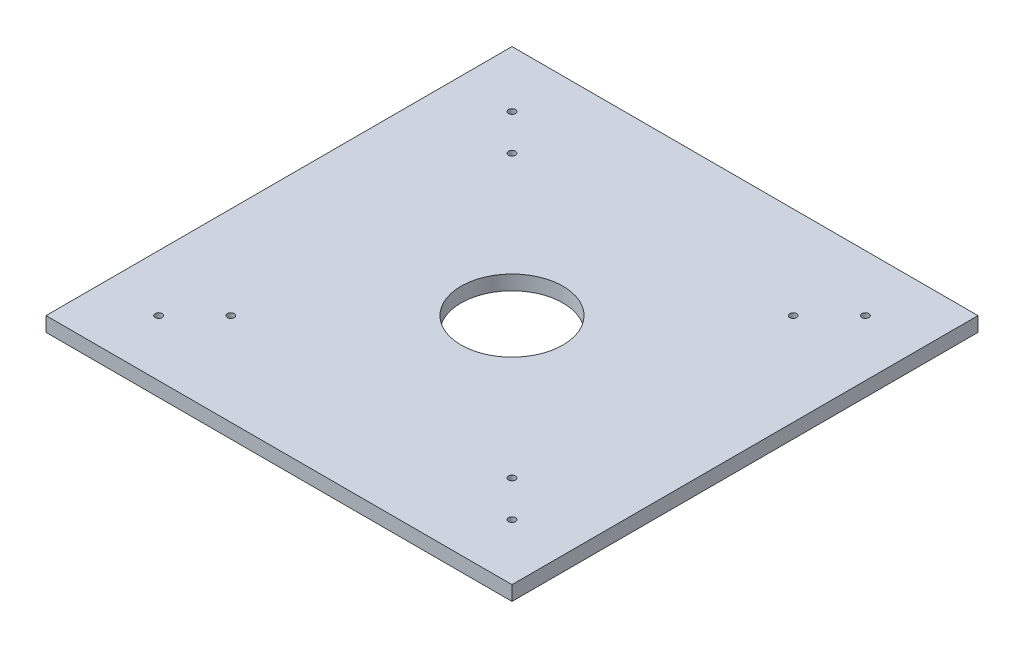
ISO-10303-21;
HEADER;
FILE_DESCRIPTION(('STEP AP214'),'2;1');
FILE_NAME('part.step','',(''),(''),'','','');
FILE_SCHEMA(('AUTOMOTIVE_DESIGN { 1 0 10303 214 1 1 1 1 }'));
ENDSEC;
DATA;
#1=APPLICATION_CONTEXT('core data for automotive mechanical design processes');
#2=APPLICATION_PROTOCOL_DEFINITION('international standard','automotive_design',2000,#1);
#3=PRODUCT_CONTEXT('',#1,'mechanical');
#4=PRODUCT('Part','Part','',(#3));
#5=PRODUCT_RELATED_PRODUCT_CATEGORY('part','',(#4));
#6=PRODUCT_DEFINITION_FORMATION('','',#4);
#7=PRODUCT_DEFINITION_CONTEXT('part definition',#1,'design');
#8=PRODUCT_DEFINITION('design','',#6,#7);
#9=PRODUCT_DEFINITION_SHAPE('','',#8);
#10=(LENGTH_UNIT() NAMED_UNIT(*) SI_UNIT(.MILLI.,.METRE.));
#11=(NAMED_UNIT(*) PLANE_ANGLE_UNIT() SI_UNIT($,.RADIAN.));
#12=(NAMED_UNIT(*) SI_UNIT($,.STERADIAN.) SOLID_ANGLE_UNIT());
#13=UNCERTAINTY_MEASURE_WITH_UNIT(LENGTH_MEASURE(1.E-05),#10,'distance_accuracy_value','');
#14=(GEOMETRIC_REPRESENTATION_CONTEXT(3) GLOBAL_UNCERTAINTY_ASSIGNED_CONTEXT((#13)) GLOBAL_UNIT_ASSIGNED_CONTEXT((#10,
#11,#12)) REPRESENTATION_CONTEXT('',''));
#15=CARTESIAN_POINT('',(0.,0.,0.));
#16=DIRECTION('',(0.,0.,1.));
#17=DIRECTION('',(1.,0.,0.));
#18=AXIS2_PLACEMENT_3D('',#15,#16,#17);
#19=CARTESIAN_POINT('',(0.,5.,0.));
#20=DIRECTION('',(0.,-1.,0.));
#21=DIRECTION('',(0.,0.,-1.));
#22=AXIS2_PLACEMENT_3D('',#19,#20,#21);
#23=PLANE('',#22);
#24=DIRECTION('',(0.,0.,-1.));
#25=VECTOR('',#24,1.);
#26=CARTESIAN_POINT('',(80.,5.,80.));
#27=LINE('',#26,#25);
#28=CARTESIAN_POINT('',(80.,5.,80.));
#29=VERTEX_POINT('',#28);
#30=CARTESIAN_POINT('',(80.,5.,-80.));
#31=VERTEX_POINT('',#30);
#32=EDGE_CURVE('E85',#29,#31,#27,.T.);
#33=ORIENTED_EDGE('',*,*,#32,.T.);
#34=DIRECTION('',(-1.,0.,0.));
#35=VECTOR('',#34,1.);
#36=CARTESIAN_POINT('',(-80.,5.,-80.));
#37=LINE('',#36,#35);
#38=CARTESIAN_POINT('',(-80.,5.,-80.));
#39=VERTEX_POINT('',#38);
#40=EDGE_CURVE('E80',#31,#39,#37,.T.);
#41=ORIENTED_EDGE('',*,*,#40,.T.);
#42=DIRECTION('',(0.,0.,1.));
#43=VECTOR('',#42,1.);
#44=CARTESIAN_POINT('',(-80.,5.,80.));
#45=LINE('',#44,#43);
#46=CARTESIAN_POINT('',(-80.,5.,80.));
#47=VERTEX_POINT('',#46);
#48=EDGE_CURVE('E83',#39,#47,#45,.T.);
#49=ORIENTED_EDGE('',*,*,#48,.T.);
#50=DIRECTION('',(1.,0.,0.));
#51=VECTOR('',#50,1.);
#52=CARTESIAN_POINT('',(-80.,5.,80.));
#53=LINE('',#52,#51);
#54=EDGE_CURVE('E50',#47,#29,#53,.T.);
#55=ORIENTED_EDGE('',*,*,#54,.T.);
#56=EDGE_LOOP('',(#33,#41,#49,#55));
#57=FACE_BOUND('',#56,.T.);
#58=CARTESIAN_POINT('',(-60.6642066420664,5.,-60.6642066420664));
#59=DIRECTION('',(0.,1.,0.));
#60=DIRECTION('',(0.,0.,1.));
#61=AXIS2_PLACEMENT_3D('',#58,#59,#60);
#62=CIRCLE('',#61,1.2);
#63=CARTESIAN_POINT('',(-60.6642066420664,5.,-59.4642066420664));
#64=VERTEX_POINT('',#63);
#65=EDGE_CURVE('E100',#64,#64,#62,.T.);
#66=ORIENTED_EDGE('',*,*,#65,.F.);
#67=EDGE_LOOP('',(#66));
#68=FACE_BOUND('',#67,.T.);
#69=CARTESIAN_POINT('',(-48.2795521345399,5.,-48.2795521345399));
#70=DIRECTION('',(0.,1.,0.));
#71=DIRECTION('',(0.,0.,1.));
#72=AXIS2_PLACEMENT_3D('',#69,#70,#71);
#73=CIRCLE('',#72,1.2);
#74=CARTESIAN_POINT('',(-48.2795521345399,5.,-47.0795521345399));
#75=VERTEX_POINT('',#74);
#76=EDGE_CURVE('E115',#75,#75,#73,.T.);
#77=ORIENTED_EDGE('',*,*,#76,.F.);
#78=EDGE_LOOP('',(#77));
#79=FACE_BOUND('',#78,.T.);
#80=CARTESIAN_POINT('',(48.2795521345399,5.,-48.2795521345399));
#81=DIRECTION('',(0.,1.,0.));
#82=DIRECTION('',(0.,0.,-1.));
#83=AXIS2_PLACEMENT_3D('',#80,#81,#82);
#84=CIRCLE('',#83,1.2);
#85=CARTESIAN_POINT('',(48.2795521345399,5.,-49.4795521345399));
#86=VERTEX_POINT('',#85);
#87=EDGE_CURVE('E121',#86,#86,#84,.T.);
#88=ORIENTED_EDGE('',*,*,#87,.F.);
#89=EDGE_LOOP('',(#88));
#90=FACE_BOUND('',#89,.T.);
#91=CARTESIAN_POINT('',(60.6642066420665,5.,-60.6642066420664));
#92=DIRECTION('',(0.,1.,0.));
#93=DIRECTION('',(0.,0.,-1.));
#94=AXIS2_PLACEMENT_3D('',#91,#92,#93);
#95=CIRCLE('',#94,1.2);
#96=CARTESIAN_POINT('',(60.6642066420665,5.,-61.8642066420664));
#97=VERTEX_POINT('',#96);
#98=EDGE_CURVE('E127',#97,#97,#95,.T.);
#99=ORIENTED_EDGE('',*,*,#98,.F.);
#100=EDGE_LOOP('',(#99));
#101=FACE_BOUND('',#100,.T.);
#102=CARTESIAN_POINT('',(60.6642066420665,5.,60.6642066420664));
#103=DIRECTION('',(0.,1.,0.));
#104=DIRECTION('',(0.,0.,1.));
#105=AXIS2_PLACEMENT_3D('',#102,#103,#104);
#106=CIRCLE('',#105,1.2);
#107=CARTESIAN_POINT('',(60.6642066420665,5.,61.8642066420664));
#108=VERTEX_POINT('',#107);
#109=EDGE_CURVE('E133',#108,#108,#106,.T.);
#110=ORIENTED_EDGE('',*,*,#109,.F.);
#111=EDGE_LOOP('',(#110));
#112=FACE_BOUND('',#111,.T.);
#113=CARTESIAN_POINT('',(48.2795521345399,5.,48.2795521345398));
#114=DIRECTION('',(0.,1.,0.));
#115=DIRECTION('',(0.,0.,1.));
#116=AXIS2_PLACEMENT_3D('',#113,#114,#115);
#117=CIRCLE('',#116,1.2);
#118=CARTESIAN_POINT('',(48.2795521345399,5.,49.4795521345398));
#119=VERTEX_POINT('',#118);
#120=EDGE_CURVE('E139',#119,#119,#117,.T.);
#121=ORIENTED_EDGE('',*,*,#120,.F.);
#122=EDGE_LOOP('',(#121));
#123=FACE_BOUND('',#122,.T.);
#124=CARTESIAN_POINT('',(-48.2795521345399,5.,48.2795521345399));
#125=DIRECTION('',(0.,1.,0.));
#126=DIRECTION('',(0.,0.,-1.));
#127=AXIS2_PLACEMENT_3D('',#124,#125,#126);
#128=CIRCLE('',#127,1.2);
#129=CARTESIAN_POINT('',(-48.2795521345399,5.,47.0795521345399));
#130=VERTEX_POINT('',#129);
#131=EDGE_CURVE('E145',#130,#130,#128,.T.);
#132=ORIENTED_EDGE('',*,*,#131,.F.);
#133=EDGE_LOOP('',(#132));
#134=FACE_BOUND('',#133,.T.);
#135=CARTESIAN_POINT('',(-60.6642066420664,5.,60.6642066420664));
#136=DIRECTION('',(0.,1.,0.));
#137=DIRECTION('',(0.,0.,-1.));
#138=AXIS2_PLACEMENT_3D('',#135,#136,#137);
#139=CIRCLE('',#138,1.2);
#140=CARTESIAN_POINT('',(-60.6642066420664,5.,59.4642066420664));
#141=VERTEX_POINT('',#140);
#142=EDGE_CURVE('E151',#141,#141,#139,.T.);
#143=ORIENTED_EDGE('',*,*,#142,.F.);
#144=EDGE_LOOP('',(#143));
#145=FACE_BOUND('',#144,.T.);
#146=CARTESIAN_POINT('',(0.,5.,0.));
#147=DIRECTION('',(0.,1.,0.));
#148=DIRECTION('',(0.,0.,1.));
#149=AXIS2_PLACEMENT_3D('',#146,#147,#148);
#150=CIRCLE('',#149,17.5);
#151=CARTESIAN_POINT('',(0.,5.,17.5));
#152=VERTEX_POINT('',#151);
#153=EDGE_CURVE('E157',#152,#152,#150,.T.);
#154=ORIENTED_EDGE('',*,*,#153,.F.);
#155=EDGE_LOOP('',(#154));
#156=FACE_BOUND('',#155,.T.);
#157=ADVANCED_FACE('F33',(#57,#68,#79,#90,#101,#112,#123,#134,#145,#156),#23,.F.);
#158=CARTESIAN_POINT('',(0.,0.,0.));
#159=DIRECTION('',(0.,-1.,0.));
#160=DIRECTION('',(0.,0.,-1.));
#161=AXIS2_PLACEMENT_3D('',#158,#159,#160);
#162=PLANE('',#161);
#163=CARTESIAN_POINT('',(-60.6642066420664,0.,60.6642066420664));
#164=DIRECTION('',(0.,1.,0.));
#165=DIRECTION('',(0.,0.,-1.));
#166=AXIS2_PLACEMENT_3D('',#163,#164,#165);
#167=CIRCLE('',#166,1.2);
#168=CARTESIAN_POINT('',(-60.6642066420664,0.,59.4642066420664));
#169=VERTEX_POINT('',#168);
#170=EDGE_CURVE('E154',#169,#169,#167,.T.);
#171=ORIENTED_EDGE('',*,*,#170,.T.);
#172=EDGE_LOOP('',(#171));
#173=FACE_BOUND('',#172,.T.);
#174=CARTESIAN_POINT('',(48.2795521345399,0.,48.2795521345398));
#175=DIRECTION('',(0.,1.,0.));
#176=DIRECTION('',(0.,0.,1.));
#177=AXIS2_PLACEMENT_3D('',#174,#175,#176);
#178=CIRCLE('',#177,1.2);
#179=CARTESIAN_POINT('',(48.2795521345399,0.,49.4795521345398));
#180=VERTEX_POINT('',#179);
#181=EDGE_CURVE('E142',#180,#180,#178,.T.);
#182=ORIENTED_EDGE('',*,*,#181,.T.);
#183=EDGE_LOOP('',(#182));
#184=FACE_BOUND('',#183,.T.);
#185=CARTESIAN_POINT('',(60.6642066420665,0.,-60.6642066420664));
#186=DIRECTION('',(0.,1.,0.));
#187=DIRECTION('',(0.,0.,-1.));
#188=AXIS2_PLACEMENT_3D('',#185,#186,#187);
#189=CIRCLE('',#188,1.2);
#190=CARTESIAN_POINT('',(60.6642066420665,0.,-61.8642066420664));
#191=VERTEX_POINT('',#190);
#192=EDGE_CURVE('E130',#191,#191,#189,.T.);
#193=ORIENTED_EDGE('',*,*,#192,.T.);
#194=EDGE_LOOP('',(#193));
#195=FACE_BOUND('',#194,.T.);
#196=CARTESIAN_POINT('',(-48.2795521345399,0.,-48.2795521345399));
#197=DIRECTION('',(0.,1.,0.));
#198=DIRECTION('',(0.,0.,1.));
#199=AXIS2_PLACEMENT_3D('',#196,#197,#198);
#200=CIRCLE('',#199,1.2);
#201=CARTESIAN_POINT('',(-48.2795521345399,0.,-47.0795521345399));
#202=VERTEX_POINT('',#201);
#203=EDGE_CURVE('E118',#202,#202,#200,.T.);
#204=ORIENTED_EDGE('',*,*,#203,.T.);
#205=EDGE_LOOP('',(#204));
#206=FACE_BOUND('',#205,.T.);
#207=DIRECTION('',(0.,0.,-1.));
#208=VECTOR('',#207,1.);
#209=CARTESIAN_POINT('',(80.,0.,80.));
#210=LINE('',#209,#208);
#211=CARTESIAN_POINT('',(80.,0.,80.));
#212=VERTEX_POINT('',#211);
#213=CARTESIAN_POINT('',(80.,0.,-80.));
#214=VERTEX_POINT('',#213);
#215=EDGE_CURVE('E97',#212,#214,#210,.T.);
#216=ORIENTED_EDGE('',*,*,#215,.F.);
#217=DIRECTION('',(1.,0.,0.));
#218=VECTOR('',#217,1.);
#219=CARTESIAN_POINT('',(-80.,0.,80.));
#220=LINE('',#219,#218);
#221=CARTESIAN_POINT('',(-80.,0.,80.));
#222=VERTEX_POINT('',#221);
#223=EDGE_CURVE('E73',#222,#212,#220,.T.);
#224=ORIENTED_EDGE('',*,*,#223,.F.);
#225=DIRECTION('',(0.,0.,1.));
#226=VECTOR('',#225,1.);
#227=CARTESIAN_POINT('',(-80.,0.,80.));
#228=LINE('',#227,#226);
#229=CARTESIAN_POINT('',(-80.,0.,-80.));
#230=VERTEX_POINT('',#229);
#231=EDGE_CURVE('E67',#230,#222,#228,.T.);
#232=ORIENTED_EDGE('',*,*,#231,.F.);
#233=DIRECTION('',(-1.,0.,0.));
#234=VECTOR('',#233,1.);
#235=CARTESIAN_POINT('',(-80.,0.,-80.));
#236=LINE('',#235,#234);
#237=EDGE_CURVE('E89',#214,#230,#236,.T.);
#238=ORIENTED_EDGE('',*,*,#237,.F.);
#239=EDGE_LOOP('',(#216,#224,#232,#238));
#240=FACE_BOUND('',#239,.T.);
#241=CARTESIAN_POINT('',(-60.6642066420664,0.,-60.6642066420664));
#242=DIRECTION('',(0.,1.,0.));
#243=DIRECTION('',(0.,0.,1.));
#244=AXIS2_PLACEMENT_3D('',#241,#242,#243);
#245=CIRCLE('',#244,1.2);
#246=CARTESIAN_POINT('',(-60.6642066420664,0.,-59.4642066420664));
#247=VERTEX_POINT('',#246);
#248=EDGE_CURVE('E112',#247,#247,#245,.T.);
#249=ORIENTED_EDGE('',*,*,#248,.T.);
#250=EDGE_LOOP('',(#249));
#251=FACE_BOUND('',#250,.T.);
#252=CARTESIAN_POINT('',(48.2795521345399,0.,-48.2795521345399));
#253=DIRECTION('',(0.,1.,0.));
#254=DIRECTION('',(0.,0.,-1.));
#255=AXIS2_PLACEMENT_3D('',#252,#253,#254);
#256=CIRCLE('',#255,1.2);
#257=CARTESIAN_POINT('',(48.2795521345399,0.,-49.4795521345399));
#258=VERTEX_POINT('',#257);
#259=EDGE_CURVE('E124',#258,#258,#256,.T.);
#260=ORIENTED_EDGE('',*,*,#259,.T.);
#261=EDGE_LOOP('',(#260));
#262=FACE_BOUND('',#261,.T.);
#263=CARTESIAN_POINT('',(60.6642066420665,0.,60.6642066420664));
#264=DIRECTION('',(0.,1.,0.));
#265=DIRECTION('',(0.,0.,1.));
#266=AXIS2_PLACEMENT_3D('',#263,#264,#265);
#267=CIRCLE('',#266,1.2);
#268=CARTESIAN_POINT('',(60.6642066420665,0.,61.8642066420664));
#269=VERTEX_POINT('',#268);
#270=EDGE_CURVE('E136',#269,#269,#267,.T.);
#271=ORIENTED_EDGE('',*,*,#270,.T.);
#272=EDGE_LOOP('',(#271));
#273=FACE_BOUND('',#272,.T.);
#274=CARTESIAN_POINT('',(-48.2795521345399,0.,48.2795521345399));
#275=DIRECTION('',(0.,1.,0.));
#276=DIRECTION('',(0.,0.,-1.));
#277=AXIS2_PLACEMENT_3D('',#274,#275,#276);
#278=CIRCLE('',#277,1.2);
#279=CARTESIAN_POINT('',(-48.2795521345399,0.,47.0795521345399));
#280=VERTEX_POINT('',#279);
#281=EDGE_CURVE('E148',#280,#280,#278,.T.);
#282=ORIENTED_EDGE('',*,*,#281,.T.);
#283=EDGE_LOOP('',(#282));
#284=FACE_BOUND('',#283,.T.);
#285=CARTESIAN_POINT('',(0.,0.,0.));
#286=DIRECTION('',(0.,1.,0.));
#287=DIRECTION('',(0.,0.,1.));
#288=AXIS2_PLACEMENT_3D('',#285,#286,#287);
#289=CIRCLE('',#288,17.5);
#290=CARTESIAN_POINT('',(0.,0.,17.5));
#291=VERTEX_POINT('',#290);
#292=EDGE_CURVE('E160',#291,#291,#289,.T.);
#293=ORIENTED_EDGE('',*,*,#292,.T.);
#294=EDGE_LOOP('',(#293));
#295=FACE_BOUND('',#294,.T.);
#296=ADVANCED_FACE('F108',(#173,#184,#195,#206,#240,#251,#262,#273,#284,#295),#162,.T.);
#297=CARTESIAN_POINT('',(80.,5.,80.));
#298=DIRECTION('',(-1.,0.,0.));
#299=DIRECTION('',(0.,0.,1.));
#300=AXIS2_PLACEMENT_3D('',#297,#298,#299);
#301=PLANE('',#300);
#302=ORIENTED_EDGE('',*,*,#215,.T.);
#303=DIRECTION('',(0.,-1.,0.));
#304=VECTOR('',#303,1.);
#305=CARTESIAN_POINT('',(80.,5.,-80.));
#306=LINE('',#305,#304);
#307=EDGE_CURVE('E11',#31,#214,#306,.T.);
#308=ORIENTED_EDGE('',*,*,#307,.F.);
#309=ORIENTED_EDGE('',*,*,#32,.F.);
#310=DIRECTION('',(0.,-1.,0.));
#311=VECTOR('',#310,1.);
#312=CARTESIAN_POINT('',(80.,5.,80.));
#313=LINE('',#312,#311);
#314=EDGE_CURVE('E93',#29,#212,#313,.T.);
#315=ORIENTED_EDGE('',*,*,#314,.T.);
#316=EDGE_LOOP('',(#302,#308,#309,#315));
#317=FACE_BOUND('',#316,.T.);
#318=ADVANCED_FACE('F35',(#317),#301,.F.);
#319=CARTESIAN_POINT('',(-80.,5.,-80.));
#320=DIRECTION('',(0.,0.,1.));
#321=DIRECTION('',(1.,0.,0.));
#322=AXIS2_PLACEMENT_3D('',#319,#320,#321);
#323=PLANE('',#322);
#324=ORIENTED_EDGE('',*,*,#237,.T.);
#325=DIRECTION('',(0.,-1.,0.));
#326=VECTOR('',#325,1.);
#327=CARTESIAN_POINT('',(-80.,5.,-80.));
#328=LINE('',#327,#326);
#329=EDGE_CURVE('E42',#39,#230,#328,.T.);
#330=ORIENTED_EDGE('',*,*,#329,.F.);
#331=ORIENTED_EDGE('',*,*,#40,.F.);
#332=ORIENTED_EDGE('',*,*,#307,.T.);
#333=EDGE_LOOP('',(#324,#330,#331,#332));
#334=FACE_BOUND('',#333,.T.);
#335=ADVANCED_FACE('F88',(#334),#323,.F.);
#336=CARTESIAN_POINT('',(-80.,5.,80.));
#337=DIRECTION('',(1.,0.,0.));
#338=DIRECTION('',(0.,0.,-1.));
#339=AXIS2_PLACEMENT_3D('',#336,#337,#338);
#340=PLANE('',#339);
#341=ORIENTED_EDGE('',*,*,#231,.T.);
#342=DIRECTION('',(0.,-1.,0.));
#343=VECTOR('',#342,1.);
#344=CARTESIAN_POINT('',(-80.,5.,80.));
#345=LINE('',#344,#343);
#346=EDGE_CURVE('E90',#47,#222,#345,.T.);
#347=ORIENTED_EDGE('',*,*,#346,.F.);
#348=ORIENTED_EDGE('',*,*,#48,.F.);
#349=ORIENTED_EDGE('',*,*,#329,.T.);
#350=EDGE_LOOP('',(#341,#347,#348,#349));
#351=FACE_BOUND('',#350,.T.);
#352=ADVANCED_FACE('F91',(#351),#340,.F.);
#353=CARTESIAN_POINT('',(-80.,5.,80.));
#354=DIRECTION('',(0.,0.,-1.));
#355=DIRECTION('',(-1.,0.,0.));
#356=AXIS2_PLACEMENT_3D('',#353,#354,#355);
#357=PLANE('',#356);
#358=ORIENTED_EDGE('',*,*,#223,.T.);
#359=ORIENTED_EDGE('',*,*,#314,.F.);
#360=ORIENTED_EDGE('',*,*,#54,.F.);
#361=ORIENTED_EDGE('',*,*,#346,.T.);
#362=EDGE_LOOP('',(#358,#359,#360,#361));
#363=FACE_BOUND('',#362,.T.);
#364=ADVANCED_FACE('F105',(#363),#357,.F.);
#365=CARTESIAN_POINT('',(-60.6642066420664,5.,-60.6642066420664));
#366=DIRECTION('',(0.,-1.,0.));
#367=DIRECTION('',(0.,0.,-1.));
#368=AXIS2_PLACEMENT_3D('',#365,#366,#367);
#369=CYLINDRICAL_SURFACE('',#368,1.2);
#370=ORIENTED_EDGE('',*,*,#65,.T.);
#371=EDGE_LOOP('',(#370));
#372=FACE_BOUND('',#371,.T.);
#373=ORIENTED_EDGE('',*,*,#248,.F.);
#374=EDGE_LOOP('',(#373));
#375=FACE_BOUND('',#374,.T.);
#376=ADVANCED_FACE('F177',(#372,#375),#369,.F.);
#377=CARTESIAN_POINT('',(-48.2795521345399,5.,-48.2795521345399));
#378=DIRECTION('',(0.,-1.,0.));
#379=DIRECTION('',(0.,0.,-1.));
#380=AXIS2_PLACEMENT_3D('',#377,#378,#379);
#381=CYLINDRICAL_SURFACE('',#380,1.2);
#382=ORIENTED_EDGE('',*,*,#76,.T.);
#383=EDGE_LOOP('',(#382));
#384=FACE_BOUND('',#383,.T.);
#385=ORIENTED_EDGE('',*,*,#203,.F.);
#386=EDGE_LOOP('',(#385));
#387=FACE_BOUND('',#386,.T.);
#388=ADVANCED_FACE('F223',(#384,#387),#381,.F.);
#389=CARTESIAN_POINT('',(48.2795521345399,5.,-48.2795521345399));
#390=DIRECTION('',(0.,-1.,0.));
#391=DIRECTION('',(0.,0.,-1.));
#392=AXIS2_PLACEMENT_3D('',#389,#390,#391);
#393=CYLINDRICAL_SURFACE('',#392,1.2);
#394=ORIENTED_EDGE('',*,*,#87,.T.);
#395=EDGE_LOOP('',(#394));
#396=FACE_BOUND('',#395,.T.);
#397=ORIENTED_EDGE('',*,*,#259,.F.);
#398=EDGE_LOOP('',(#397));
#399=FACE_BOUND('',#398,.T.);
#400=ADVANCED_FACE('F231',(#396,#399),#393,.F.);
#401=CARTESIAN_POINT('',(60.6642066420665,5.,-60.6642066420664));
#402=DIRECTION('',(0.,-1.,0.));
#403=DIRECTION('',(0.,0.,-1.));
#404=AXIS2_PLACEMENT_3D('',#401,#402,#403);
#405=CYLINDRICAL_SURFACE('',#404,1.2);
#406=ORIENTED_EDGE('',*,*,#98,.T.);
#407=EDGE_LOOP('',(#406));
#408=FACE_BOUND('',#407,.T.);
#409=ORIENTED_EDGE('',*,*,#192,.F.);
#410=EDGE_LOOP('',(#409));
#411=FACE_BOUND('',#410,.T.);
#412=ADVANCED_FACE('F239',(#408,#411),#405,.F.);
#413=CARTESIAN_POINT('',(60.6642066420665,5.,60.6642066420664));
#414=DIRECTION('',(0.,-1.,0.));
#415=DIRECTION('',(0.,0.,-1.));
#416=AXIS2_PLACEMENT_3D('',#413,#414,#415);
#417=CYLINDRICAL_SURFACE('',#416,1.2);
#418=ORIENTED_EDGE('',*,*,#109,.T.);
#419=EDGE_LOOP('',(#418));
#420=FACE_BOUND('',#419,.T.);
#421=ORIENTED_EDGE('',*,*,#270,.F.);
#422=EDGE_LOOP('',(#421));
#423=FACE_BOUND('',#422,.T.);
#424=ADVANCED_FACE('F248',(#420,#423),#417,.F.);
#425=CARTESIAN_POINT('',(48.2795521345399,5.,48.2795521345398));
#426=DIRECTION('',(0.,-1.,0.));
#427=DIRECTION('',(0.,0.,-1.));
#428=AXIS2_PLACEMENT_3D('',#425,#426,#427);
#429=CYLINDRICAL_SURFACE('',#428,1.2);
#430=ORIENTED_EDGE('',*,*,#120,.T.);
#431=EDGE_LOOP('',(#430));
#432=FACE_BOUND('',#431,.T.);
#433=ORIENTED_EDGE('',*,*,#181,.F.);
#434=EDGE_LOOP('',(#433));
#435=FACE_BOUND('',#434,.T.);
#436=ADVANCED_FACE('F257',(#432,#435),#429,.F.);
#437=CARTESIAN_POINT('',(-48.2795521345399,5.,48.2795521345399));
#438=DIRECTION('',(0.,-1.,0.));
#439=DIRECTION('',(0.,0.,-1.));
#440=AXIS2_PLACEMENT_3D('',#437,#438,#439);
#441=CYLINDRICAL_SURFACE('',#440,1.2);
#442=ORIENTED_EDGE('',*,*,#131,.T.);
#443=EDGE_LOOP('',(#442));
#444=FACE_BOUND('',#443,.T.);
#445=ORIENTED_EDGE('',*,*,#281,.F.);
#446=EDGE_LOOP('',(#445));
#447=FACE_BOUND('',#446,.T.);
#448=ADVANCED_FACE('F266',(#444,#447),#441,.F.);
#449=CARTESIAN_POINT('',(-60.6642066420664,5.,60.6642066420664));
#450=DIRECTION('',(0.,-1.,0.));
#451=DIRECTION('',(0.,0.,-1.));
#452=AXIS2_PLACEMENT_3D('',#449,#450,#451);
#453=CYLINDRICAL_SURFACE('',#452,1.2);
#454=ORIENTED_EDGE('',*,*,#142,.T.);
#455=EDGE_LOOP('',(#454));
#456=FACE_BOUND('',#455,.T.);
#457=ORIENTED_EDGE('',*,*,#170,.F.);
#458=EDGE_LOOP('',(#457));
#459=FACE_BOUND('',#458,.T.);
#460=ADVANCED_FACE('F275',(#456,#459),#453,.F.);
#461=CARTESIAN_POINT('',(0.,5.,0.));
#462=DIRECTION('',(0.,-1.,0.));
#463=DIRECTION('',(0.,0.,-1.));
#464=AXIS2_PLACEMENT_3D('',#461,#462,#463);
#465=CYLINDRICAL_SURFACE('',#464,17.5);
#466=ORIENTED_EDGE('',*,*,#153,.T.);
#467=EDGE_LOOP('',(#466));
#468=FACE_BOUND('',#467,.T.);
#469=ORIENTED_EDGE('',*,*,#292,.F.);
#470=EDGE_LOOP('',(#469));
#471=FACE_BOUND('',#470,.T.);
#472=ADVANCED_FACE('F166',(#468,#471),#465,.F.);
#473=CLOSED_SHELL('',(#157,#296,#318,#335,#352,#364,#376,#388,#400,#412,#424,#436,#448,#460,#472));
#474=MANIFOLD_SOLID_BREP('B2',#473);
#475=ADVANCED_BREP_SHAPE_REPRESENTATION('',(#18,#474),#14);
#476=SHAPE_DEFINITION_REPRESENTATION(#9,#475);
ENDSEC;
END-ISO-10303-21;
